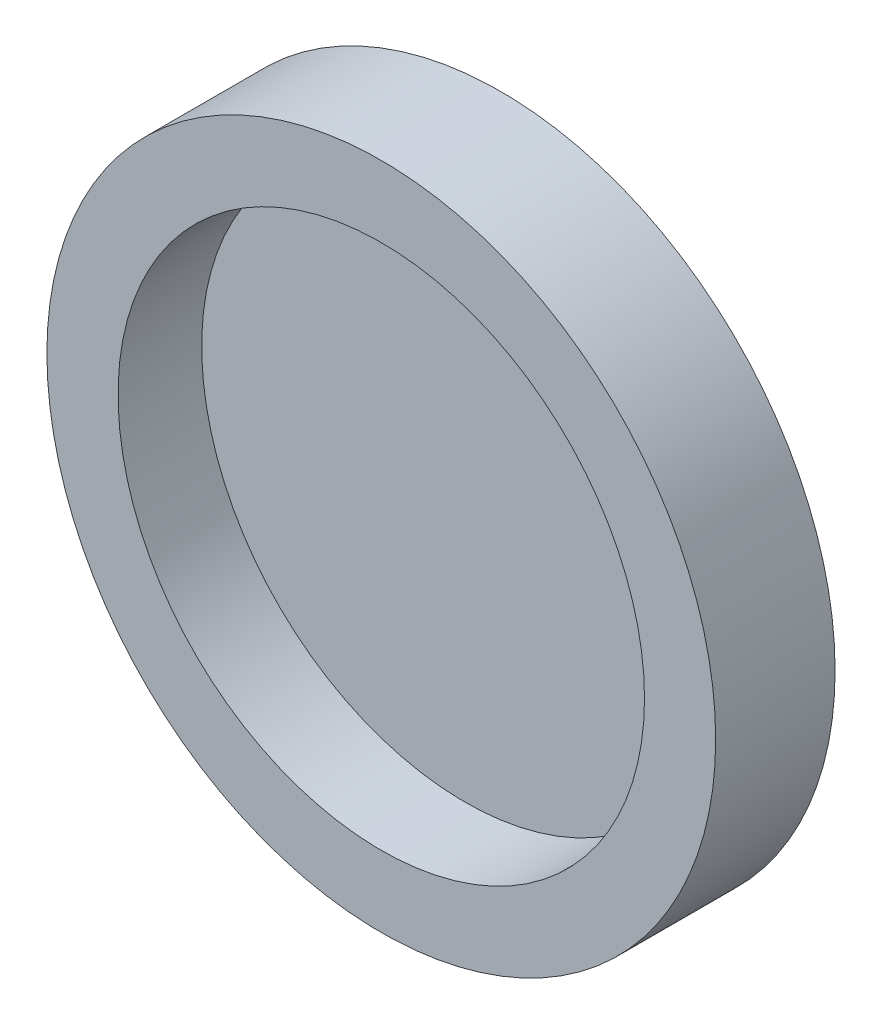
ISO-10303-21;
HEADER;
FILE_DESCRIPTION(('STEP AP214'),'2;1');
FILE_NAME('part.step','',(''),(''),'','','');
FILE_SCHEMA(('AUTOMOTIVE_DESIGN { 1 0 10303 214 1 1 1 1 }'));
ENDSEC;
DATA;
#1=APPLICATION_CONTEXT('core data for automotive mechanical design processes');
#2=APPLICATION_PROTOCOL_DEFINITION('international standard','automotive_design',2000,#1);
#3=PRODUCT_CONTEXT('',#1,'mechanical');
#4=PRODUCT('Part','Part','',(#3));
#5=PRODUCT_RELATED_PRODUCT_CATEGORY('part','',(#4));
#6=PRODUCT_DEFINITION_FORMATION('','',#4);
#7=PRODUCT_DEFINITION_CONTEXT('part definition',#1,'design');
#8=PRODUCT_DEFINITION('design','',#6,#7);
#9=PRODUCT_DEFINITION_SHAPE('','',#8);
#10=(LENGTH_UNIT() NAMED_UNIT(*) SI_UNIT(.MILLI.,.METRE.));
#11=(NAMED_UNIT(*) PLANE_ANGLE_UNIT() SI_UNIT($,.RADIAN.));
#12=(NAMED_UNIT(*) SI_UNIT($,.STERADIAN.) SOLID_ANGLE_UNIT());
#13=UNCERTAINTY_MEASURE_WITH_UNIT(LENGTH_MEASURE(1.E-05),#10,'distance_accuracy_value','');
#14=(GEOMETRIC_REPRESENTATION_CONTEXT(3) GLOBAL_UNCERTAINTY_ASSIGNED_CONTEXT((#13)) GLOBAL_UNIT_ASSIGNED_CONTEXT((#10,
#11,#12)) REPRESENTATION_CONTEXT('',''));
#15=CARTESIAN_POINT('',(0.,0.,0.));
#16=DIRECTION('',(0.,0.,1.));
#17=DIRECTION('',(1.,0.,0.));
#18=AXIS2_PLACEMENT_3D('',#15,#16,#17);
#19=CARTESIAN_POINT('',(0.,0.,5.));
#20=DIRECTION('',(0.,0.,-1.));
#21=DIRECTION('',(-1.,0.,0.));
#22=AXIS2_PLACEMENT_3D('',#19,#20,#21);
#23=CYLINDRICAL_SURFACE('',#22,14.);
#24=CARTESIAN_POINT('',(0.,0.,5.));
#25=DIRECTION('',(0.,0.,1.));
#26=DIRECTION('',(1.,0.,0.));
#27=AXIS2_PLACEMENT_3D('',#24,#25,#26);
#28=CIRCLE('',#27,14.);
#29=CARTESIAN_POINT('',(14.,0.,5.));
#30=VERTEX_POINT('',#29);
#31=EDGE_CURVE('E10',#30,#30,#28,.T.);
#32=ORIENTED_EDGE('',*,*,#31,.F.);
#33=EDGE_LOOP('',(#32));
#34=FACE_BOUND('',#33,.T.);
#35=CARTESIAN_POINT('',(0.,0.,0.));
#36=DIRECTION('',(0.,0.,1.));
#37=DIRECTION('',(1.,0.,0.));
#38=AXIS2_PLACEMENT_3D('',#35,#36,#37);
#39=CIRCLE('',#38,14.);
#40=CARTESIAN_POINT('',(14.,0.,0.));
#41=VERTEX_POINT('',#40);
#42=EDGE_CURVE('E40',#41,#41,#39,.T.);
#43=ORIENTED_EDGE('',*,*,#42,.T.);
#44=EDGE_LOOP('',(#43));
#45=FACE_BOUND('',#44,.T.);
#46=ADVANCED_FACE('F37',(#34,#45),#23,.T.);
#47=CARTESIAN_POINT('',(0.,0.,5.));
#48=DIRECTION('',(0.,0.,1.));
#49=DIRECTION('',(1.,0.,0.));
#50=AXIS2_PLACEMENT_3D('',#47,#48,#49);
#51=PLANE('',#50);
#52=CARTESIAN_POINT('',(0.,0.,5.));
#53=DIRECTION('',(0.,0.,1.));
#54=DIRECTION('',(1.,0.,0.));
#55=AXIS2_PLACEMENT_3D('',#52,#53,#54);
#56=CIRCLE('',#55,11.02);
#57=CARTESIAN_POINT('',(11.02,0.,5.));
#58=VERTEX_POINT('',#57);
#59=EDGE_CURVE('E49',#58,#58,#56,.T.);
#60=ORIENTED_EDGE('',*,*,#59,.F.);
#61=EDGE_LOOP('',(#60));
#62=FACE_BOUND('',#61,.T.);
#63=ORIENTED_EDGE('',*,*,#31,.T.);
#64=EDGE_LOOP('',(#63));
#65=FACE_BOUND('',#64,.T.);
#66=ADVANCED_FACE('F64',(#62,#65),#51,.T.);
#67=CARTESIAN_POINT('',(0.,0.,0.));
#68=DIRECTION('',(0.,0.,1.));
#69=DIRECTION('',(1.,0.,0.));
#70=AXIS2_PLACEMENT_3D('',#67,#68,#69);
#71=PLANE('',#70);
#72=ORIENTED_EDGE('',*,*,#42,.F.);
#73=EDGE_LOOP('',(#72));
#74=FACE_BOUND('',#73,.T.);
#75=ADVANCED_FACE('F60',(#74),#71,.F.);
#76=CARTESIAN_POINT('',(0.,0.,1.5));
#77=DIRECTION('',(0.,0.,1.));
#78=DIRECTION('',(1.,0.,0.));
#79=AXIS2_PLACEMENT_3D('',#76,#77,#78);
#80=CYLINDRICAL_SURFACE('',#79,11.02);
#81=CARTESIAN_POINT('',(0.,0.,1.5));
#82=DIRECTION('',(0.,0.,1.));
#83=DIRECTION('',(1.,0.,0.));
#84=AXIS2_PLACEMENT_3D('',#81,#82,#83);
#85=CIRCLE('',#84,11.02);
#86=CARTESIAN_POINT('',(11.02,0.,1.5));
#87=VERTEX_POINT('',#86);
#88=EDGE_CURVE('E47',#87,#87,#85,.T.);
#89=ORIENTED_EDGE('',*,*,#88,.F.);
#90=EDGE_LOOP('',(#89));
#91=FACE_BOUND('',#90,.T.);
#92=ORIENTED_EDGE('',*,*,#59,.T.);
#93=EDGE_LOOP('',(#92));
#94=FACE_BOUND('',#93,.T.);
#95=ADVANCED_FACE('F57',(#91,#94),#80,.F.);
#96=CARTESIAN_POINT('',(0.,0.,1.5));
#97=DIRECTION('',(0.,0.,1.));
#98=DIRECTION('',(1.,0.,0.));
#99=AXIS2_PLACEMENT_3D('',#96,#97,#98);
#100=PLANE('',#99);
#101=ORIENTED_EDGE('',*,*,#88,.T.);
#102=EDGE_LOOP('',(#101));
#103=FACE_BOUND('',#102,.T.);
#104=ADVANCED_FACE('F55',(#103),#100,.T.);
#105=CLOSED_SHELL('',(#46,#66,#75,#95,#104));
#106=MANIFOLD_SOLID_BREP('B2',#105);
#107=ADVANCED_BREP_SHAPE_REPRESENTATION('',(#18,#106),#14);
#108=SHAPE_DEFINITION_REPRESENTATION(#9,#107);
ENDSEC;
END-ISO-10303-21;
